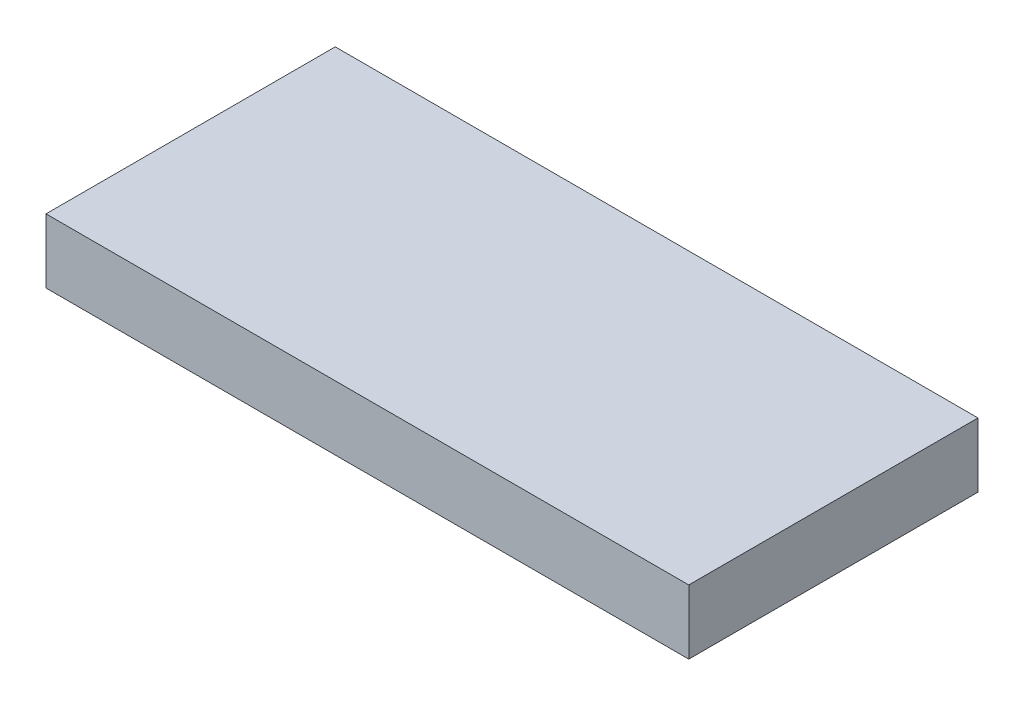
ISO-10303-21;
HEADER;
FILE_DESCRIPTION(('STEP AP214'),'2;1');
FILE_NAME('part.step','',(''),(''),'','','');
FILE_SCHEMA(('AUTOMOTIVE_DESIGN { 1 0 10303 214 1 1 1 1 }'));
ENDSEC;
DATA;
#1=APPLICATION_CONTEXT('core data for automotive mechanical design processes');
#2=APPLICATION_PROTOCOL_DEFINITION('international standard','automotive_design',2000,#1);
#3=PRODUCT_CONTEXT('',#1,'mechanical');
#4=PRODUCT('Part','Part','',(#3));
#5=PRODUCT_RELATED_PRODUCT_CATEGORY('part','',(#4));
#6=PRODUCT_DEFINITION_FORMATION('','',#4);
#7=PRODUCT_DEFINITION_CONTEXT('part definition',#1,'design');
#8=PRODUCT_DEFINITION('design','',#6,#7);
#9=PRODUCT_DEFINITION_SHAPE('','',#8);
#10=(LENGTH_UNIT() NAMED_UNIT(*) SI_UNIT(.MILLI.,.METRE.));
#11=(NAMED_UNIT(*) PLANE_ANGLE_UNIT() SI_UNIT($,.RADIAN.));
#12=(NAMED_UNIT(*) SI_UNIT($,.STERADIAN.) SOLID_ANGLE_UNIT());
#13=UNCERTAINTY_MEASURE_WITH_UNIT(LENGTH_MEASURE(1.E-05),#10,'distance_accuracy_value','');
#14=(GEOMETRIC_REPRESENTATION_CONTEXT(3) GLOBAL_UNCERTAINTY_ASSIGNED_CONTEXT((#13)) GLOBAL_UNIT_ASSIGNED_CONTEXT((#10,
#11,#12)) REPRESENTATION_CONTEXT('',''));
#15=CARTESIAN_POINT('',(0.,0.,0.));
#16=DIRECTION('',(0.,0.,1.));
#17=DIRECTION('',(1.,0.,0.));
#18=AXIS2_PLACEMENT_3D('',#15,#16,#17);
#19=CARTESIAN_POINT('',(-50.,10.,22.5));
#20=DIRECTION('',(1.,0.,0.));
#21=DIRECTION('',(0.,0.,-1.));
#22=AXIS2_PLACEMENT_3D('',#19,#20,#21);
#23=PLANE('',#22);
#24=DIRECTION('',(0.,0.,1.));
#25=VECTOR('',#24,1.);
#26=CARTESIAN_POINT('',(-50.,0.,22.5));
#27=LINE('',#26,#25);
#28=CARTESIAN_POINT('',(-50.,0.,-22.5));
#29=VERTEX_POINT('',#28);
#30=CARTESIAN_POINT('',(-50.,0.,22.5));
#31=VERTEX_POINT('',#30);
#32=EDGE_CURVE('E96',#29,#31,#27,.T.);
#33=ORIENTED_EDGE('',*,*,#32,.T.);
#34=DIRECTION('',(0.,-1.,0.));
#35=VECTOR('',#34,1.);
#36=CARTESIAN_POINT('',(-50.,10.,22.5));
#37=LINE('',#36,#35);
#38=CARTESIAN_POINT('',(-50.,10.,22.5));
#39=VERTEX_POINT('',#38);
#40=EDGE_CURVE('E11',#39,#31,#37,.T.);
#41=ORIENTED_EDGE('',*,*,#40,.F.);
#42=DIRECTION('',(0.,0.,1.));
#43=VECTOR('',#42,1.);
#44=CARTESIAN_POINT('',(-50.,10.,22.5));
#45=LINE('',#44,#43);
#46=CARTESIAN_POINT('',(-50.,10.,-22.5));
#47=VERTEX_POINT('',#46);
#48=EDGE_CURVE('E84',#47,#39,#45,.T.);
#49=ORIENTED_EDGE('',*,*,#48,.F.);
#50=DIRECTION('',(0.,-1.,0.));
#51=VECTOR('',#50,1.);
#52=CARTESIAN_POINT('',(-50.,10.,-22.5));
#53=LINE('',#52,#51);
#54=EDGE_CURVE('E92',#47,#29,#53,.T.);
#55=ORIENTED_EDGE('',*,*,#54,.T.);
#56=EDGE_LOOP('',(#33,#41,#49,#55));
#57=FACE_BOUND('',#56,.T.);
#58=ADVANCED_FACE('F33',(#57),#23,.F.);
#59=CARTESIAN_POINT('',(50.,10.,22.5));
#60=DIRECTION('',(0.,0.,-1.));
#61=DIRECTION('',(-1.,0.,0.));
#62=AXIS2_PLACEMENT_3D('',#59,#60,#61);
#63=PLANE('',#62);
#64=DIRECTION('',(1.,0.,0.));
#65=VECTOR('',#64,1.);
#66=CARTESIAN_POINT('',(50.,0.,22.5));
#67=LINE('',#66,#65);
#68=CARTESIAN_POINT('',(50.,0.,22.5));
#69=VERTEX_POINT('',#68);
#70=EDGE_CURVE('E88',#31,#69,#67,.T.);
#71=ORIENTED_EDGE('',*,*,#70,.T.);
#72=DIRECTION('',(0.,-1.,0.));
#73=VECTOR('',#72,1.);
#74=CARTESIAN_POINT('',(50.,10.,22.5));
#75=LINE('',#74,#73);
#76=CARTESIAN_POINT('',(50.,10.,22.5));
#77=VERTEX_POINT('',#76);
#78=EDGE_CURVE('E41',#77,#69,#75,.T.);
#79=ORIENTED_EDGE('',*,*,#78,.F.);
#80=DIRECTION('',(1.,0.,0.));
#81=VECTOR('',#80,1.);
#82=CARTESIAN_POINT('',(50.,10.,22.5));
#83=LINE('',#82,#81);
#84=EDGE_CURVE('E79',#39,#77,#83,.T.);
#85=ORIENTED_EDGE('',*,*,#84,.F.);
#86=ORIENTED_EDGE('',*,*,#40,.T.);
#87=EDGE_LOOP('',(#71,#79,#85,#86));
#88=FACE_BOUND('',#87,.T.);
#89=ADVANCED_FACE('F87',(#88),#63,.F.);
#90=CARTESIAN_POINT('',(50.,10.,22.5));
#91=DIRECTION('',(-1.,0.,0.));
#92=DIRECTION('',(0.,0.,1.));
#93=AXIS2_PLACEMENT_3D('',#90,#91,#92);
#94=PLANE('',#93);
#95=DIRECTION('',(0.,0.,-1.));
#96=VECTOR('',#95,1.);
#97=CARTESIAN_POINT('',(50.,0.,22.5));
#98=LINE('',#97,#96);
#99=CARTESIAN_POINT('',(50.,0.,-22.5));
#100=VERTEX_POINT('',#99);
#101=EDGE_CURVE('E66',#69,#100,#98,.T.);
#102=ORIENTED_EDGE('',*,*,#101,.T.);
#103=DIRECTION('',(0.,-1.,0.));
#104=VECTOR('',#103,1.);
#105=CARTESIAN_POINT('',(50.,10.,-22.5));
#106=LINE('',#105,#104);
#107=CARTESIAN_POINT('',(50.,10.,-22.5));
#108=VERTEX_POINT('',#107);
#109=EDGE_CURVE('E89',#108,#100,#106,.T.);
#110=ORIENTED_EDGE('',*,*,#109,.F.);
#111=DIRECTION('',(0.,0.,-1.));
#112=VECTOR('',#111,1.);
#113=CARTESIAN_POINT('',(50.,10.,22.5));
#114=LINE('',#113,#112);
#115=EDGE_CURVE('E82',#77,#108,#114,.T.);
#116=ORIENTED_EDGE('',*,*,#115,.F.);
#117=ORIENTED_EDGE('',*,*,#78,.T.);
#118=EDGE_LOOP('',(#102,#110,#116,#117));
#119=FACE_BOUND('',#118,.T.);
#120=ADVANCED_FACE('F90',(#119),#94,.F.);
#121=CARTESIAN_POINT('',(50.,10.,-22.5));
#122=DIRECTION('',(0.,0.,1.));
#123=DIRECTION('',(1.,0.,0.));
#124=AXIS2_PLACEMENT_3D('',#121,#122,#123);
#125=PLANE('',#124);
#126=DIRECTION('',(-1.,0.,0.));
#127=VECTOR('',#126,1.);
#128=CARTESIAN_POINT('',(50.,0.,-22.5));
#129=LINE('',#128,#127);
#130=EDGE_CURVE('E72',#100,#29,#129,.T.);
#131=ORIENTED_EDGE('',*,*,#130,.T.);
#132=ORIENTED_EDGE('',*,*,#54,.F.);
#133=DIRECTION('',(-1.,0.,0.));
#134=VECTOR('',#133,1.);
#135=CARTESIAN_POINT('',(50.,10.,-22.5));
#136=LINE('',#135,#134);
#137=EDGE_CURVE('E49',#108,#47,#136,.T.);
#138=ORIENTED_EDGE('',*,*,#137,.F.);
#139=ORIENTED_EDGE('',*,*,#109,.T.);
#140=EDGE_LOOP('',(#131,#132,#138,#139));
#141=FACE_BOUND('',#140,.T.);
#142=ADVANCED_FACE('F103',(#141),#125,.F.);
#143=CARTESIAN_POINT('',(0.,10.,0.));
#144=DIRECTION('',(0.,1.,0.));
#145=DIRECTION('',(0.,0.,1.));
#146=AXIS2_PLACEMENT_3D('',#143,#144,#145);
#147=PLANE('',#146);
#148=ORIENTED_EDGE('',*,*,#48,.T.);
#149=ORIENTED_EDGE('',*,*,#84,.T.);
#150=ORIENTED_EDGE('',*,*,#115,.T.);
#151=ORIENTED_EDGE('',*,*,#137,.T.);
#152=EDGE_LOOP('',(#148,#149,#150,#151));
#153=FACE_BOUND('',#152,.T.);
#154=ADVANCED_FACE('F80',(#153),#147,.T.);
#155=CARTESIAN_POINT('',(0.,0.,0.));
#156=DIRECTION('',(0.,1.,0.));
#157=DIRECTION('',(0.,0.,1.));
#158=AXIS2_PLACEMENT_3D('',#155,#156,#157);
#159=PLANE('',#158);
#160=ORIENTED_EDGE('',*,*,#32,.F.);
#161=ORIENTED_EDGE('',*,*,#130,.F.);
#162=ORIENTED_EDGE('',*,*,#101,.F.);
#163=ORIENTED_EDGE('',*,*,#70,.F.);
#164=EDGE_LOOP('',(#160,#161,#162,#163));
#165=FACE_BOUND('',#164,.T.);
#166=ADVANCED_FACE('F106',(#165),#159,.F.);
#167=CLOSED_SHELL('',(#58,#89,#120,#142,#154,#166));
#168=MANIFOLD_SOLID_BREP('B2',#167);
#169=ADVANCED_BREP_SHAPE_REPRESENTATION('',(#18,#168),#14);
#170=SHAPE_DEFINITION_REPRESENTATION(#9,#169);
ENDSEC;
END-ISO-10303-21;
